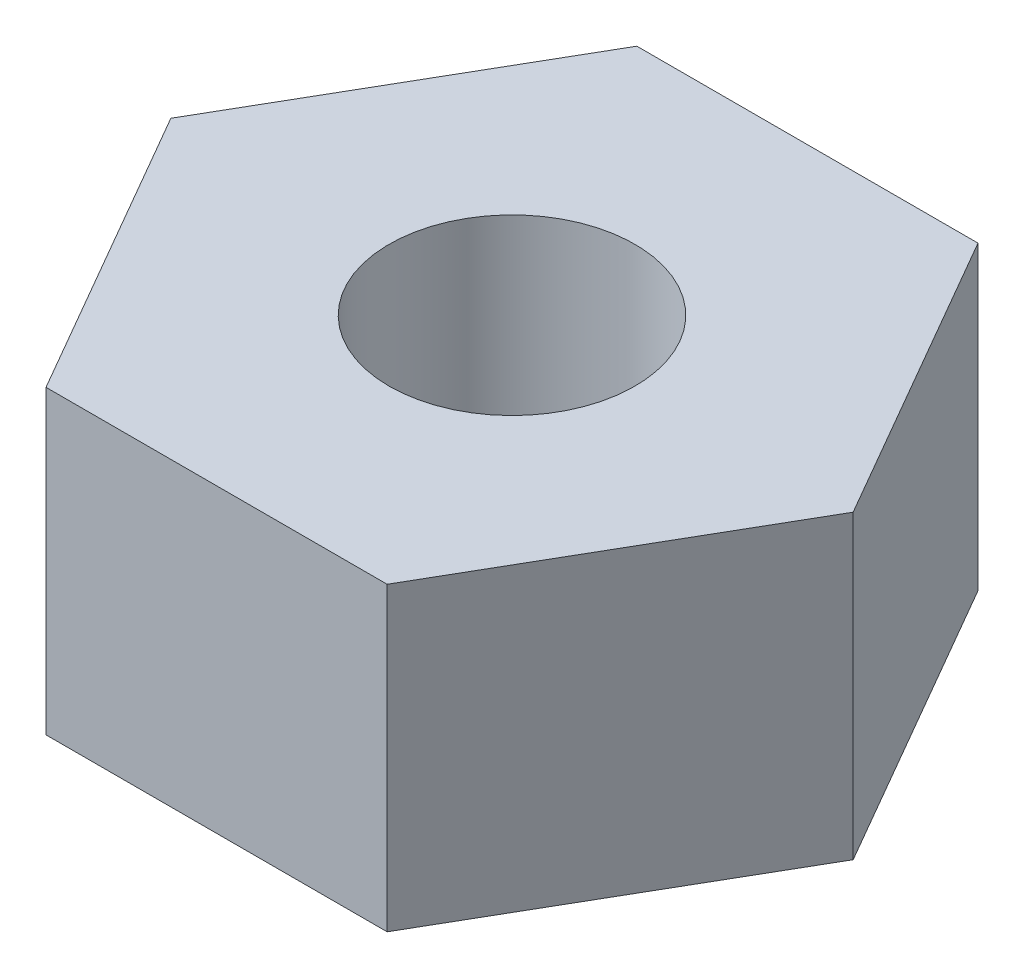
ISO-10303-21;
HEADER;
FILE_DESCRIPTION(('STEP AP214'),'2;1');
FILE_NAME('part.step','',(''),(''),'','','');
FILE_SCHEMA(('AUTOMOTIVE_DESIGN { 1 0 10303 214 1 1 1 1 }'));
ENDSEC;
DATA;
#1=APPLICATION_CONTEXT('core data for automotive mechanical design processes');
#2=APPLICATION_PROTOCOL_DEFINITION('international standard','automotive_design',2000,#1);
#3=PRODUCT_CONTEXT('',#1,'mechanical');
#4=PRODUCT('Part','Part','',(#3));
#5=PRODUCT_RELATED_PRODUCT_CATEGORY('part','',(#4));
#6=PRODUCT_DEFINITION_FORMATION('','',#4);
#7=PRODUCT_DEFINITION_CONTEXT('part definition',#1,'design');
#8=PRODUCT_DEFINITION('design','',#6,#7);
#9=PRODUCT_DEFINITION_SHAPE('','',#8);
#10=(LENGTH_UNIT() NAMED_UNIT(*) SI_UNIT(.MILLI.,.METRE.));
#11=(NAMED_UNIT(*) PLANE_ANGLE_UNIT() SI_UNIT($,.RADIAN.));
#12=(NAMED_UNIT(*) SI_UNIT($,.STERADIAN.) SOLID_ANGLE_UNIT());
#13=UNCERTAINTY_MEASURE_WITH_UNIT(LENGTH_MEASURE(1.E-05),#10,'distance_accuracy_value','');
#14=(GEOMETRIC_REPRESENTATION_CONTEXT(3) GLOBAL_UNCERTAINTY_ASSIGNED_CONTEXT((#13)) GLOBAL_UNIT_ASSIGNED_CONTEXT((#10,
#11,#12)) REPRESENTATION_CONTEXT('',''));
#15=CARTESIAN_POINT('',(0.,0.,0.));
#16=DIRECTION('',(0.,0.,1.));
#17=DIRECTION('',(1.,0.,0.));
#18=AXIS2_PLACEMENT_3D('',#15,#16,#17);
#19=CARTESIAN_POINT('',(0.,6.,5.88897274573418));
#20=DIRECTION('',(0.,0.,-1.));
#21=DIRECTION('',(-1.,0.,0.));
#22=AXIS2_PLACEMENT_3D('',#19,#20,#21);
#23=PLANE('',#22);
#24=DIRECTION('',(1.,0.,0.));
#25=VECTOR('',#24,1.);
#26=CARTESIAN_POINT('',(0.,0.,5.88897274573418));
#27=LINE('',#26,#25);
#28=CARTESIAN_POINT('',(-3.4,0.,5.88897274573418));
#29=VERTEX_POINT('',#28);
#30=CARTESIAN_POINT('',(3.4,0.,5.88897274573419));
#31=VERTEX_POINT('',#30);
#32=EDGE_CURVE('E135',#29,#31,#27,.T.);
#33=ORIENTED_EDGE('',*,*,#32,.T.);
#34=DIRECTION('',(0.,-1.,0.));
#35=VECTOR('',#34,1.);
#36=CARTESIAN_POINT('',(3.4,6.,5.88897274573419));
#37=LINE('',#36,#35);
#38=CARTESIAN_POINT('',(3.4,6.,5.88897274573419));
#39=VERTEX_POINT('',#38);
#40=EDGE_CURVE('E11',#39,#31,#37,.T.);
#41=ORIENTED_EDGE('',*,*,#40,.F.);
#42=DIRECTION('',(1.,0.,0.));
#43=VECTOR('',#42,1.);
#44=CARTESIAN_POINT('',(0.,6.,5.88897274573418));
#45=LINE('',#44,#43);
#46=CARTESIAN_POINT('',(-3.4,6.,5.88897274573418));
#47=VERTEX_POINT('',#46);
#48=EDGE_CURVE('E168',#47,#39,#45,.T.);
#49=ORIENTED_EDGE('',*,*,#48,.F.);
#50=DIRECTION('',(0.,-1.,0.));
#51=VECTOR('',#50,1.);
#52=CARTESIAN_POINT('',(-3.4,6.,5.88897274573418));
#53=LINE('',#52,#51);
#54=EDGE_CURVE('E127',#47,#29,#53,.T.);
#55=ORIENTED_EDGE('',*,*,#54,.T.);
#56=EDGE_LOOP('',(#33,#41,#49,#55));
#57=FACE_BOUND('',#56,.T.);
#58=ADVANCED_FACE('F41',(#57),#23,.F.);
#59=CARTESIAN_POINT('',(5.1,6.,2.94448637286709));
#60=DIRECTION('',(-0.866025403784439,0.,-0.5));
#61=DIRECTION('',(-0.5,0.,0.866025403784439));
#62=AXIS2_PLACEMENT_3D('',#59,#60,#61);
#63=PLANE('',#62);
#64=DIRECTION('',(0.5,0.,-0.866025403784439));
#65=VECTOR('',#64,1.);
#66=CARTESIAN_POINT('',(5.1,0.,2.94448637286709));
#67=LINE('',#66,#65);
#68=CARTESIAN_POINT('',(6.8,0.,0.));
#69=VERTEX_POINT('',#68);
#70=EDGE_CURVE('E139',#31,#69,#67,.T.);
#71=ORIENTED_EDGE('',*,*,#70,.T.);
#72=DIRECTION('',(0.,-1.,0.));
#73=VECTOR('',#72,1.);
#74=CARTESIAN_POINT('',(6.8,6.,0.));
#75=LINE('',#74,#73);
#76=CARTESIAN_POINT('',(6.8,6.,0.));
#77=VERTEX_POINT('',#76);
#78=EDGE_CURVE('E51',#77,#69,#75,.T.);
#79=ORIENTED_EDGE('',*,*,#78,.F.);
#80=DIRECTION('',(0.5,0.,-0.866025403784439));
#81=VECTOR('',#80,1.);
#82=CARTESIAN_POINT('',(5.1,6.,2.94448637286709));
#83=LINE('',#82,#81);
#84=EDGE_CURVE('E96',#39,#77,#83,.T.);
#85=ORIENTED_EDGE('',*,*,#84,.F.);
#86=ORIENTED_EDGE('',*,*,#40,.T.);
#87=EDGE_LOOP('',(#71,#79,#85,#86));
#88=FACE_BOUND('',#87,.T.);
#89=ADVANCED_FACE('F182',(#88),#63,.F.);
#90=CARTESIAN_POINT('',(5.1,6.,-2.94448637286709));
#91=DIRECTION('',(-0.866025403784439,0.,0.5));
#92=DIRECTION('',(0.5,0.,0.866025403784439));
#93=AXIS2_PLACEMENT_3D('',#90,#91,#92);
#94=PLANE('',#93);
#95=DIRECTION('',(-0.5,0.,-0.866025403784439));
#96=VECTOR('',#95,1.);
#97=CARTESIAN_POINT('',(5.1,0.,-2.94448637286709));
#98=LINE('',#97,#96);
#99=CARTESIAN_POINT('',(3.4,0.,-5.88897274573418));
#100=VERTEX_POINT('',#99);
#101=EDGE_CURVE('E142',#69,#100,#98,.T.);
#102=ORIENTED_EDGE('',*,*,#101,.T.);
#103=DIRECTION('',(0.,-1.,0.));
#104=VECTOR('',#103,1.);
#105=CARTESIAN_POINT('',(3.4,6.,-5.88897274573418));
#106=LINE('',#105,#104);
#107=CARTESIAN_POINT('',(3.4,6.,-5.88897274573418));
#108=VERTEX_POINT('',#107);
#109=EDGE_CURVE('E120',#108,#100,#106,.T.);
#110=ORIENTED_EDGE('',*,*,#109,.F.);
#111=DIRECTION('',(-0.5,0.,-0.866025403784439));
#112=VECTOR('',#111,1.);
#113=CARTESIAN_POINT('',(5.1,6.,-2.94448637286709));
#114=LINE('',#113,#112);
#115=EDGE_CURVE('E109',#77,#108,#114,.T.);
#116=ORIENTED_EDGE('',*,*,#115,.F.);
#117=ORIENTED_EDGE('',*,*,#78,.T.);
#118=EDGE_LOOP('',(#102,#110,#116,#117));
#119=FACE_BOUND('',#118,.T.);
#120=ADVANCED_FACE('F161',(#119),#94,.F.);
#121=CARTESIAN_POINT('',(0.,6.,-5.88897274573418));
#122=DIRECTION('',(0.,0.,1.));
#123=DIRECTION('',(1.,0.,0.));
#124=AXIS2_PLACEMENT_3D('',#121,#122,#123);
#125=PLANE('',#124);
#126=DIRECTION('',(-1.,0.,0.));
#127=VECTOR('',#126,1.);
#128=CARTESIAN_POINT('',(0.,0.,-5.88897274573418));
#129=LINE('',#128,#127);
#130=CARTESIAN_POINT('',(-3.4,0.,-5.88897274573418));
#131=VERTEX_POINT('',#130);
#132=EDGE_CURVE('E118',#100,#131,#129,.T.);
#133=ORIENTED_EDGE('',*,*,#132,.T.);
#134=DIRECTION('',(0.,-1.,0.));
#135=VECTOR('',#134,1.);
#136=CARTESIAN_POINT('',(-3.4,6.,-5.88897274573418));
#137=LINE('',#136,#135);
#138=CARTESIAN_POINT('',(-3.4,6.,-5.88897274573418));
#139=VERTEX_POINT('',#138);
#140=EDGE_CURVE('E115',#139,#131,#137,.T.);
#141=ORIENTED_EDGE('',*,*,#140,.F.);
#142=DIRECTION('',(-1.,0.,0.));
#143=VECTOR('',#142,1.);
#144=CARTESIAN_POINT('',(0.,6.,-5.88897274573418));
#145=LINE('',#144,#143);
#146=EDGE_CURVE('E103',#108,#139,#145,.T.);
#147=ORIENTED_EDGE('',*,*,#146,.F.);
#148=ORIENTED_EDGE('',*,*,#109,.T.);
#149=EDGE_LOOP('',(#133,#141,#147,#148));
#150=FACE_BOUND('',#149,.T.);
#151=ADVANCED_FACE('F116',(#150),#125,.F.);
#152=CARTESIAN_POINT('',(-5.1,6.,-2.94448637286709));
#153=DIRECTION('',(0.866025403784439,0.,0.5));
#154=DIRECTION('',(0.5,0.,-0.866025403784439));
#155=AXIS2_PLACEMENT_3D('',#152,#153,#154);
#156=PLANE('',#155);
#157=DIRECTION('',(-0.5,0.,0.866025403784439));
#158=VECTOR('',#157,1.);
#159=CARTESIAN_POINT('',(-5.1,0.,-2.94448637286709));
#160=LINE('',#159,#158);
#161=CARTESIAN_POINT('',(-6.8,0.,0.));
#162=VERTEX_POINT('',#161);
#163=EDGE_CURVE('E82',#131,#162,#160,.T.);
#164=ORIENTED_EDGE('',*,*,#163,.T.);
#165=DIRECTION('',(0.,-1.,0.));
#166=VECTOR('',#165,1.);
#167=CARTESIAN_POINT('',(-6.8,6.,0.));
#168=LINE('',#167,#166);
#169=CARTESIAN_POINT('',(-6.8,6.,0.));
#170=VERTEX_POINT('',#169);
#171=EDGE_CURVE('E121',#170,#162,#168,.T.);
#172=ORIENTED_EDGE('',*,*,#171,.F.);
#173=DIRECTION('',(-0.5,0.,0.866025403784439));
#174=VECTOR('',#173,1.);
#175=CARTESIAN_POINT('',(-5.1,6.,-2.94448637286709));
#176=LINE('',#175,#174);
#177=EDGE_CURVE('E107',#139,#170,#176,.T.);
#178=ORIENTED_EDGE('',*,*,#177,.F.);
#179=ORIENTED_EDGE('',*,*,#140,.T.);
#180=EDGE_LOOP('',(#164,#172,#178,#179));
#181=FACE_BOUND('',#180,.T.);
#182=ADVANCED_FACE('F123',(#181),#156,.F.);
#183=CARTESIAN_POINT('',(0.,6.,0.));
#184=DIRECTION('',(0.,-1.,0.));
#185=DIRECTION('',(0.,0.,-1.));
#186=AXIS2_PLACEMENT_3D('',#183,#184,#185);
#187=CYLINDRICAL_SURFACE('',#186,2.45);
#188=CARTESIAN_POINT('',(0.,6.,0.));
#189=DIRECTION('',(0.,1.,0.));
#190=DIRECTION('',(0.,0.,1.));
#191=AXIS2_PLACEMENT_3D('',#188,#189,#190);
#192=CIRCLE('',#191,2.45);
#193=CARTESIAN_POINT('',(0.,6.,2.45));
#194=VERTEX_POINT('',#193);
#195=EDGE_CURVE('E151',#194,#194,#192,.T.);
#196=ORIENTED_EDGE('',*,*,#195,.T.);
#197=EDGE_LOOP('',(#196));
#198=FACE_BOUND('',#197,.T.);
#199=CARTESIAN_POINT('',(0.,0.,0.));
#200=DIRECTION('',(0.,1.,0.));
#201=DIRECTION('',(0.,0.,1.));
#202=AXIS2_PLACEMENT_3D('',#199,#200,#201);
#203=CIRCLE('',#202,2.45);
#204=CARTESIAN_POINT('',(0.,0.,2.45));
#205=VERTEX_POINT('',#204);
#206=EDGE_CURVE('E131',#205,#205,#203,.T.);
#207=ORIENTED_EDGE('',*,*,#206,.F.);
#208=EDGE_LOOP('',(#207));
#209=FACE_BOUND('',#208,.T.);
#210=ADVANCED_FACE('F43',(#198,#209),#187,.F.);
#211=CARTESIAN_POINT('',(-5.1,6.,2.94448637286709));
#212=DIRECTION('',(0.866025403784439,0.,-0.5));
#213=DIRECTION('',(-0.5,0.,-0.866025403784439));
#214=AXIS2_PLACEMENT_3D('',#211,#212,#213);
#215=PLANE('',#214);
#216=DIRECTION('',(0.5,0.,0.866025403784439));
#217=VECTOR('',#216,1.);
#218=CARTESIAN_POINT('',(-5.1,0.,2.94448637286709));
#219=LINE('',#218,#217);
#220=EDGE_CURVE('E88',#162,#29,#219,.T.);
#221=ORIENTED_EDGE('',*,*,#220,.T.);
#222=ORIENTED_EDGE('',*,*,#54,.F.);
#223=DIRECTION('',(0.5,0.,0.866025403784439));
#224=VECTOR('',#223,1.);
#225=CARTESIAN_POINT('',(-5.1,6.,2.94448637286709));
#226=LINE('',#225,#224);
#227=EDGE_CURVE('E59',#170,#47,#226,.T.);
#228=ORIENTED_EDGE('',*,*,#227,.F.);
#229=ORIENTED_EDGE('',*,*,#171,.T.);
#230=EDGE_LOOP('',(#221,#222,#228,#229));
#231=FACE_BOUND('',#230,.T.);
#232=ADVANCED_FACE('F169',(#231),#215,.F.);
#233=CARTESIAN_POINT('',(0.,6.,0.));
#234=DIRECTION('',(0.,1.,0.));
#235=DIRECTION('',(0.,0.,1.));
#236=AXIS2_PLACEMENT_3D('',#233,#234,#235);
#237=PLANE('',#236);
#238=ORIENTED_EDGE('',*,*,#195,.F.);
#239=EDGE_LOOP('',(#238));
#240=FACE_BOUND('',#239,.T.);
#241=ORIENTED_EDGE('',*,*,#48,.T.);
#242=ORIENTED_EDGE('',*,*,#84,.T.);
#243=ORIENTED_EDGE('',*,*,#115,.T.);
#244=ORIENTED_EDGE('',*,*,#146,.T.);
#245=ORIENTED_EDGE('',*,*,#177,.T.);
#246=ORIENTED_EDGE('',*,*,#227,.T.);
#247=EDGE_LOOP('',(#241,#242,#243,#244,#245,#246));
#248=FACE_BOUND('',#247,.T.);
#249=ADVANCED_FACE('F105',(#240,#248),#237,.T.);
#250=CARTESIAN_POINT('',(0.,0.,0.));
#251=DIRECTION('',(0.,1.,0.));
#252=DIRECTION('',(0.,0.,1.));
#253=AXIS2_PLACEMENT_3D('',#250,#251,#252);
#254=PLANE('',#253);
#255=ORIENTED_EDGE('',*,*,#206,.T.);
#256=EDGE_LOOP('',(#255));
#257=FACE_BOUND('',#256,.T.);
#258=ORIENTED_EDGE('',*,*,#32,.F.);
#259=ORIENTED_EDGE('',*,*,#220,.F.);
#260=ORIENTED_EDGE('',*,*,#163,.F.);
#261=ORIENTED_EDGE('',*,*,#132,.F.);
#262=ORIENTED_EDGE('',*,*,#101,.F.);
#263=ORIENTED_EDGE('',*,*,#70,.F.);
#264=EDGE_LOOP('',(#258,#259,#260,#261,#262,#263));
#265=FACE_BOUND('',#264,.T.);
#266=ADVANCED_FACE('F164',(#257,#265),#254,.F.);
#267=CLOSED_SHELL('',(#58,#89,#120,#151,#182,#210,#232,#249,#266));
#268=MANIFOLD_SOLID_BREP('B2',#267);
#269=ADVANCED_BREP_SHAPE_REPRESENTATION('',(#18,#268),#14);
#270=SHAPE_DEFINITION_REPRESENTATION(#9,#269);
ENDSEC;
END-ISO-10303-21;
